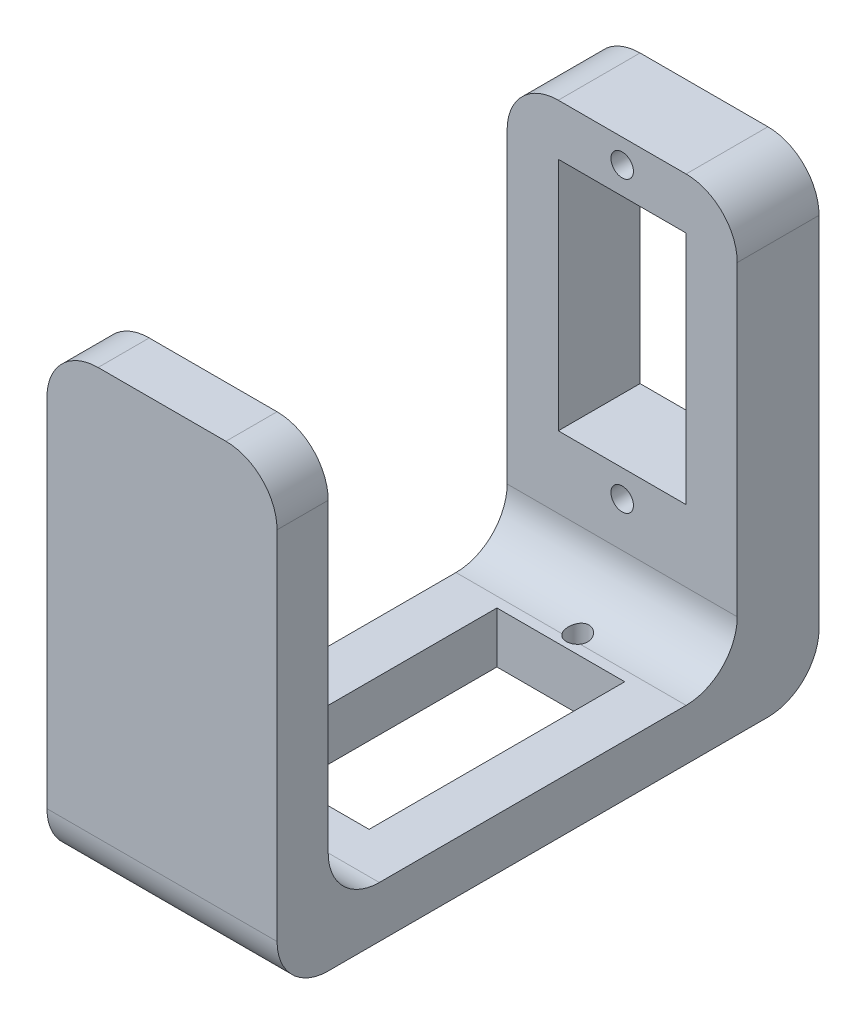
ISO-10303-21;
HEADER;
FILE_DESCRIPTION(('STEP AP214'),'2;1');
FILE_NAME('part.step','',(''),(''),'','','');
FILE_SCHEMA(('AUTOMOTIVE_DESIGN { 1 0 10303 214 1 1 1 1 }'));
ENDSEC;
DATA;
#1=APPLICATION_CONTEXT('core data for automotive mechanical design processes');
#2=APPLICATION_PROTOCOL_DEFINITION('international standard','automotive_design',2000,#1);
#3=PRODUCT_CONTEXT('',#1,'mechanical');
#4=PRODUCT('Part','Part','',(#3));
#5=PRODUCT_RELATED_PRODUCT_CATEGORY('part','',(#4));
#6=PRODUCT_DEFINITION_FORMATION('','',#4);
#7=PRODUCT_DEFINITION_CONTEXT('part definition',#1,'design');
#8=PRODUCT_DEFINITION('design','',#6,#7);
#9=PRODUCT_DEFINITION_SHAPE('','',#8);
#10=(LENGTH_UNIT() NAMED_UNIT(*) SI_UNIT(.MILLI.,.METRE.));
#11=(NAMED_UNIT(*) PLANE_ANGLE_UNIT() SI_UNIT($,.RADIAN.));
#12=(NAMED_UNIT(*) SI_UNIT($,.STERADIAN.) SOLID_ANGLE_UNIT());
#13=UNCERTAINTY_MEASURE_WITH_UNIT(LENGTH_MEASURE(1.E-05),#10,'distance_accuracy_value','');
#14=(GEOMETRIC_REPRESENTATION_CONTEXT(3) GLOBAL_UNCERTAINTY_ASSIGNED_CONTEXT((#13)) GLOBAL_UNIT_ASSIGNED_CONTEXT((#10,
#11,#12)) REPRESENTATION_CONTEXT('',''));
#15=CARTESIAN_POINT('',(0.,0.,0.));
#16=DIRECTION('',(0.,0.,1.));
#17=DIRECTION('',(1.,0.,0.));
#18=AXIS2_PLACEMENT_3D('',#15,#16,#17);
#19=CARTESIAN_POINT('',(0.,0.,8.));
#20=DIRECTION('',(0.,0.,1.));
#21=DIRECTION('',(1.,0.,0.));
#22=AXIS2_PLACEMENT_3D('',#19,#20,#21);
#23=PLANE('',#22);
#24=DIRECTION('',(-1.,0.,0.));
#25=VECTOR('',#24,1.);
#26=CARTESIAN_POINT('',(-11.25,16.5,8.));
#27=LINE('',#26,#25);
#28=CARTESIAN_POINT('',(6.24999999999999,16.5,8.));
#29=VERTEX_POINT('',#28);
#30=CARTESIAN_POINT('',(-6.25,16.5,8.));
#31=VERTEX_POINT('',#30);
#32=EDGE_CURVE('E297',#29,#31,#27,.T.);
#33=ORIENTED_EDGE('',*,*,#32,.T.);
#34=CARTESIAN_POINT('',(-6.25,11.5,8.));
#35=DIRECTION('',(0.,0.,1.));
#36=DIRECTION('',(1.,0.,0.));
#37=AXIS2_PLACEMENT_3D('',#34,#35,#36);
#38=CIRCLE('',#37,5.);
#39=CARTESIAN_POINT('',(-11.25,11.5,8.));
#40=VERTEX_POINT('',#39);
#41=EDGE_CURVE('E11',#31,#40,#38,.T.);
#42=ORIENTED_EDGE('',*,*,#41,.T.);
#43=DIRECTION('',(0.,-1.,0.));
#44=VECTOR('',#43,1.);
#45=CARTESIAN_POINT('',(-11.25,16.5,8.));
#46=LINE('',#45,#44);
#47=CARTESIAN_POINT('',(-11.25,-18.5,8.));
#48=VERTEX_POINT('',#47);
#49=EDGE_CURVE('E292',#40,#48,#46,.T.);
#50=ORIENTED_EDGE('',*,*,#49,.T.);
#51=DIRECTION('',(-1.,0.,0.));
#52=VECTOR('',#51,1.);
#53=CARTESIAN_POINT('',(0.,-18.5,8.));
#54=LINE('',#53,#52);
#55=CARTESIAN_POINT('',(11.25,-18.5,8.));
#56=VERTEX_POINT('',#55);
#57=EDGE_CURVE('E326',#48,#56,#54,.F.);
#58=ORIENTED_EDGE('',*,*,#57,.T.);
#59=DIRECTION('',(0.,1.,0.));
#60=VECTOR('',#59,1.);
#61=CARTESIAN_POINT('',(11.25,16.5,8.));
#62=LINE('',#61,#60);
#63=CARTESIAN_POINT('',(11.25,11.5,8.));
#64=VERTEX_POINT('',#63);
#65=EDGE_CURVE('E294',#56,#64,#62,.T.);
#66=ORIENTED_EDGE('',*,*,#65,.T.);
#67=CARTESIAN_POINT('',(6.25,11.5,8.));
#68=DIRECTION('',(0.,0.,1.));
#69=DIRECTION('',(1.,0.,0.));
#70=AXIS2_PLACEMENT_3D('',#67,#68,#69);
#71=CIRCLE('',#70,5.);
#72=EDGE_CURVE('E40',#64,#29,#71,.T.);
#73=ORIENTED_EDGE('',*,*,#72,.T.);
#74=EDGE_LOOP('',(#33,#42,#50,#58,#66,#73));
#75=FACE_BOUND('',#74,.T.);
#76=CARTESIAN_POINT('',(0.,-14.1452041028867,8.));
#77=DIRECTION('',(0.,0.,1.));
#78=DIRECTION('',(1.,0.,0.));
#79=AXIS2_PLACEMENT_3D('',#76,#77,#78);
#80=CIRCLE('',#79,1.1);
#81=CARTESIAN_POINT('',(1.09999999999998,-14.1452041028867,8.));
#82=VERTEX_POINT('',#81);
#83=EDGE_CURVE('E253',#82,#82,#80,.T.);
#84=ORIENTED_EDGE('',*,*,#83,.F.);
#85=EDGE_LOOP('',(#84));
#86=FACE_BOUND('',#85,.T.);
#87=CARTESIAN_POINT('',(0.,14.1452041028867,8.));
#88=DIRECTION('',(0.,0.,1.));
#89=DIRECTION('',(1.,0.,0.));
#90=AXIS2_PLACEMENT_3D('',#87,#88,#89);
#91=CIRCLE('',#90,1.09999999999999);
#92=CARTESIAN_POINT('',(1.09999999999997,14.1452041028867,8.));
#93=VERTEX_POINT('',#92);
#94=EDGE_CURVE('E248',#93,#93,#91,.T.);
#95=ORIENTED_EDGE('',*,*,#94,.F.);
#96=EDGE_LOOP('',(#95));
#97=FACE_BOUND('',#96,.T.);
#98=DIRECTION('',(-1.,0.,0.));
#99=VECTOR('',#98,1.);
#100=CARTESIAN_POINT('',(-6.25,11.5,8.));
#101=LINE('',#100,#99);
#102=CARTESIAN_POINT('',(6.25,11.5,8.));
#103=VERTEX_POINT('',#102);
#104=CARTESIAN_POINT('',(-6.25,11.5,8.));
#105=VERTEX_POINT('',#104);
#106=EDGE_CURVE('E263',#103,#105,#101,.T.);
#107=ORIENTED_EDGE('',*,*,#106,.F.);
#108=DIRECTION('',(0.,1.,0.));
#109=VECTOR('',#108,1.);
#110=CARTESIAN_POINT('',(6.25,11.5,8.));
#111=LINE('',#110,#109);
#112=CARTESIAN_POINT('',(6.25,-11.5,8.));
#113=VERTEX_POINT('',#112);
#114=EDGE_CURVE('E261',#113,#103,#111,.T.);
#115=ORIENTED_EDGE('',*,*,#114,.F.);
#116=DIRECTION('',(1.,0.,0.));
#117=VECTOR('',#116,1.);
#118=CARTESIAN_POINT('',(-6.25,-11.5,8.));
#119=LINE('',#118,#117);
#120=CARTESIAN_POINT('',(-6.25,-11.5,8.));
#121=VERTEX_POINT('',#120);
#122=EDGE_CURVE('E269',#121,#113,#119,.T.);
#123=ORIENTED_EDGE('',*,*,#122,.F.);
#124=DIRECTION('',(0.,-1.,0.));
#125=VECTOR('',#124,1.);
#126=CARTESIAN_POINT('',(-6.25,11.5,8.));
#127=LINE('',#126,#125);
#128=EDGE_CURVE('E266',#105,#121,#127,.T.);
#129=ORIENTED_EDGE('',*,*,#128,.F.);
#130=EDGE_LOOP('',(#107,#115,#123,#129));
#131=FACE_BOUND('',#130,.T.);
#132=ADVANCED_FACE('F32',(#75,#86,#97,#131),#23,.T.);
#133=CARTESIAN_POINT('',(0.,0.,0.));
#134=DIRECTION('',(0.,0.,1.));
#135=DIRECTION('',(1.,0.,0.));
#136=AXIS2_PLACEMENT_3D('',#133,#134,#135);
#137=PLANE('',#136);
#138=CARTESIAN_POINT('',(0.,-14.1452041028867,0.));
#139=DIRECTION('',(0.,0.,1.));
#140=DIRECTION('',(1.,0.,0.));
#141=AXIS2_PLACEMENT_3D('',#138,#139,#140);
#142=CIRCLE('',#141,1.1);
#143=CARTESIAN_POINT('',(1.09999999999998,-14.1452041028867,0.));
#144=VERTEX_POINT('',#143);
#145=EDGE_CURVE('E249',#144,#144,#142,.T.);
#146=ORIENTED_EDGE('',*,*,#145,.T.);
#147=EDGE_LOOP('',(#146));
#148=FACE_BOUND('',#147,.T.);
#149=CARTESIAN_POINT('',(0.,14.1452041028867,0.));
#150=DIRECTION('',(0.,0.,1.));
#151=DIRECTION('',(1.,0.,0.));
#152=AXIS2_PLACEMENT_3D('',#149,#150,#151);
#153=CIRCLE('',#152,1.09999999999999);
#154=CARTESIAN_POINT('',(1.09999999999997,14.1452041028867,0.));
#155=VERTEX_POINT('',#154);
#156=EDGE_CURVE('E256',#155,#155,#153,.T.);
#157=ORIENTED_EDGE('',*,*,#156,.T.);
#158=EDGE_LOOP('',(#157));
#159=FACE_BOUND('',#158,.T.);
#160=DIRECTION('',(0.,-1.,0.));
#161=VECTOR('',#160,1.);
#162=CARTESIAN_POINT('',(-11.25,16.5,0.));
#163=LINE('',#162,#161);
#164=CARTESIAN_POINT('',(-11.25,11.5,0.));
#165=VERTEX_POINT('',#164);
#166=CARTESIAN_POINT('',(-11.25,-23.5,0.));
#167=VERTEX_POINT('',#166);
#168=EDGE_CURVE('E291',#165,#167,#163,.T.);
#169=ORIENTED_EDGE('',*,*,#168,.F.);
#170=CARTESIAN_POINT('',(-6.25,11.5,0.));
#171=DIRECTION('',(0.,0.,1.));
#172=DIRECTION('',(1.,0.,0.));
#173=AXIS2_PLACEMENT_3D('',#170,#171,#172);
#174=CIRCLE('',#173,5.);
#175=CARTESIAN_POINT('',(-6.25,16.5,0.));
#176=VERTEX_POINT('',#175);
#177=EDGE_CURVE('E445',#165,#176,#174,.F.);
#178=ORIENTED_EDGE('',*,*,#177,.T.);
#179=DIRECTION('',(-1.,0.,0.));
#180=VECTOR('',#179,1.);
#181=CARTESIAN_POINT('',(-11.25,16.5,0.));
#182=LINE('',#181,#180);
#183=CARTESIAN_POINT('',(6.24999999999999,16.5,0.));
#184=VERTEX_POINT('',#183);
#185=EDGE_CURVE('E295',#184,#176,#182,.T.);
#186=ORIENTED_EDGE('',*,*,#185,.F.);
#187=CARTESIAN_POINT('',(6.25,11.5,0.));
#188=DIRECTION('',(0.,0.,1.));
#189=DIRECTION('',(1.,0.,0.));
#190=AXIS2_PLACEMENT_3D('',#187,#188,#189);
#191=CIRCLE('',#190,5.);
#192=CARTESIAN_POINT('',(11.25,11.5,0.));
#193=VERTEX_POINT('',#192);
#194=EDGE_CURVE('E443',#184,#193,#191,.F.);
#195=ORIENTED_EDGE('',*,*,#194,.T.);
#196=DIRECTION('',(0.,1.,0.));
#197=VECTOR('',#196,1.);
#198=CARTESIAN_POINT('',(11.25,16.5,0.));
#199=LINE('',#198,#197);
#200=CARTESIAN_POINT('',(11.25,-23.5,0.));
#201=VERTEX_POINT('',#200);
#202=EDGE_CURVE('E301',#201,#193,#199,.T.);
#203=ORIENTED_EDGE('',*,*,#202,.F.);
#204=DIRECTION('',(-1.,0.,0.));
#205=VECTOR('',#204,1.);
#206=CARTESIAN_POINT('',(-11.25,-23.5,0.));
#207=LINE('',#206,#205);
#208=EDGE_CURVE('E479',#201,#167,#207,.T.);
#209=ORIENTED_EDGE('',*,*,#208,.T.);
#210=EDGE_LOOP('',(#169,#178,#186,#195,#203,#209));
#211=FACE_BOUND('',#210,.T.);
#212=DIRECTION('',(0.,1.,0.));
#213=VECTOR('',#212,1.);
#214=CARTESIAN_POINT('',(6.25,11.5,0.));
#215=LINE('',#214,#213);
#216=CARTESIAN_POINT('',(6.25,-11.5,0.));
#217=VERTEX_POINT('',#216);
#218=CARTESIAN_POINT('',(6.25,11.5,0.));
#219=VERTEX_POINT('',#218);
#220=EDGE_CURVE('E252',#217,#219,#215,.T.);
#221=ORIENTED_EDGE('',*,*,#220,.T.);
#222=DIRECTION('',(-1.,0.,0.));
#223=VECTOR('',#222,1.);
#224=CARTESIAN_POINT('',(-6.25,11.5,0.));
#225=LINE('',#224,#223);
#226=CARTESIAN_POINT('',(-6.25,11.5,0.));
#227=VERTEX_POINT('',#226);
#228=EDGE_CURVE('E274',#219,#227,#225,.T.);
#229=ORIENTED_EDGE('',*,*,#228,.T.);
#230=DIRECTION('',(0.,-1.,0.));
#231=VECTOR('',#230,1.);
#232=CARTESIAN_POINT('',(-6.25,11.5,0.));
#233=LINE('',#232,#231);
#234=CARTESIAN_POINT('',(-6.25,-11.5,0.));
#235=VERTEX_POINT('',#234);
#236=EDGE_CURVE('E277',#227,#235,#233,.T.);
#237=ORIENTED_EDGE('',*,*,#236,.T.);
#238=DIRECTION('',(1.,0.,0.));
#239=VECTOR('',#238,1.);
#240=CARTESIAN_POINT('',(-6.25,-11.5,0.));
#241=LINE('',#240,#239);
#242=EDGE_CURVE('E264',#235,#217,#241,.T.);
#243=ORIENTED_EDGE('',*,*,#242,.T.);
#244=EDGE_LOOP('',(#221,#229,#237,#243));
#245=FACE_BOUND('',#244,.T.);
#246=ADVANCED_FACE('F381',(#148,#159,#211,#245),#137,.F.);
#247=CARTESIAN_POINT('',(-11.25,16.5,8.));
#248=DIRECTION('',(1.,0.,0.));
#249=DIRECTION('',(0.,1.,0.));
#250=AXIS2_PLACEMENT_3D('',#247,#248,#249);
#251=PLANE('',#250);
#252=DIRECTION('',(0.,-1.,0.));
#253=VECTOR('',#252,1.);
#254=CARTESIAN_POINT('',(-11.25,-28.5,53.));
#255=LINE('',#254,#253);
#256=CARTESIAN_POINT('',(-11.25,11.3655560728552,53.));
#257=VERTEX_POINT('',#256);
#258=CARTESIAN_POINT('',(-11.25,-23.5,53.));
#259=VERTEX_POINT('',#258);
#260=EDGE_CURVE('E231',#257,#259,#255,.T.);
#261=ORIENTED_EDGE('',*,*,#260,.F.);
#262=DIRECTION('',(0.,0.,1.));
#263=VECTOR('',#262,1.);
#264=CARTESIAN_POINT('',(-11.25,11.3655560728552,48.));
#265=LINE('',#264,#263);
#266=CARTESIAN_POINT('',(-11.25,11.3655560728552,48.));
#267=VERTEX_POINT('',#266);
#268=EDGE_CURVE('E441',#257,#267,#265,.F.);
#269=ORIENTED_EDGE('',*,*,#268,.T.);
#270=DIRECTION('',(0.,-1.,0.));
#271=VECTOR('',#270,1.);
#272=CARTESIAN_POINT('',(-11.25,-28.5,48.));
#273=LINE('',#272,#271);
#274=CARTESIAN_POINT('',(-11.25,-18.5,48.));
#275=VERTEX_POINT('',#274);
#276=EDGE_CURVE('E415',#267,#275,#273,.T.);
#277=ORIENTED_EDGE('',*,*,#276,.T.);
#278=CARTESIAN_POINT('',(-11.25,-18.5,43.));
#279=DIRECTION('',(1.,0.,0.));
#280=DIRECTION('',(0.,1.,0.));
#281=AXIS2_PLACEMENT_3D('',#278,#279,#280);
#282=CIRCLE('',#281,5.);
#283=CARTESIAN_POINT('',(-11.25,-23.5,43.));
#284=VERTEX_POINT('',#283);
#285=EDGE_CURVE('E477',#275,#284,#282,.T.);
#286=ORIENTED_EDGE('',*,*,#285,.T.);
#287=DIRECTION('',(0.,0.,-1.));
#288=VECTOR('',#287,1.);
#289=CARTESIAN_POINT('',(-11.25,-23.5,53.));
#290=LINE('',#289,#288);
#291=CARTESIAN_POINT('',(-11.25,-23.5,13.));
#292=VERTEX_POINT('',#291);
#293=EDGE_CURVE('E238',#284,#292,#290,.T.);
#294=ORIENTED_EDGE('',*,*,#293,.T.);
#295=CARTESIAN_POINT('',(-11.25,-18.5,13.));
#296=DIRECTION('',(1.,0.,0.));
#297=DIRECTION('',(0.,1.,0.));
#298=AXIS2_PLACEMENT_3D('',#295,#296,#297);
#299=CIRCLE('',#298,5.);
#300=EDGE_CURVE('E336',#292,#48,#299,.T.);
#301=ORIENTED_EDGE('',*,*,#300,.T.);
#302=ORIENTED_EDGE('',*,*,#49,.F.);
#303=DIRECTION('',(0.,0.,-1.));
#304=VECTOR('',#303,1.);
#305=CARTESIAN_POINT('',(-11.25,11.5,8.));
#306=LINE('',#305,#304);
#307=EDGE_CURVE('E438',#40,#165,#306,.T.);
#308=ORIENTED_EDGE('',*,*,#307,.T.);
#309=ORIENTED_EDGE('',*,*,#168,.T.);
#310=CARTESIAN_POINT('',(-11.25,-23.5,5.));
#311=DIRECTION('',(1.,0.,0.));
#312=DIRECTION('',(0.,1.,0.));
#313=AXIS2_PLACEMENT_3D('',#310,#311,#312);
#314=CIRCLE('',#313,5.);
#315=CARTESIAN_POINT('',(-11.25,-28.5,5.));
#316=VERTEX_POINT('',#315);
#317=EDGE_CURVE('E484',#167,#316,#314,.F.);
#318=ORIENTED_EDGE('',*,*,#317,.T.);
#319=DIRECTION('',(0.,0.,-1.));
#320=VECTOR('',#319,1.);
#321=CARTESIAN_POINT('',(-11.25,-28.5,33.5));
#322=LINE('',#321,#320);
#323=CARTESIAN_POINT('',(-11.25,-28.5,48.));
#324=VERTEX_POINT('',#323);
#325=EDGE_CURVE('E242',#324,#316,#322,.T.);
#326=ORIENTED_EDGE('',*,*,#325,.F.);
#327=CARTESIAN_POINT('',(-11.25,-23.5,48.));
#328=DIRECTION('',(1.,0.,0.));
#329=DIRECTION('',(0.,1.,0.));
#330=AXIS2_PLACEMENT_3D('',#327,#328,#329);
#331=CIRCLE('',#330,5.);
#332=EDGE_CURVE('E481',#324,#259,#331,.F.);
#333=ORIENTED_EDGE('',*,*,#332,.T.);
#334=EDGE_LOOP('',(#261,#269,#277,#286,#294,#301,#302,#308,#309,#318,#326,#333));
#335=FACE_BOUND('',#334,.T.);
#336=ADVANCED_FACE('F350',(#335),#251,.F.);
#337=CARTESIAN_POINT('',(11.25,16.5,8.));
#338=DIRECTION('',(-1.,0.,0.));
#339=DIRECTION('',(0.,-1.,0.));
#340=AXIS2_PLACEMENT_3D('',#337,#338,#339);
#341=PLANE('',#340);
#342=DIRECTION('',(0.,1.,0.));
#343=VECTOR('',#342,1.);
#344=CARTESIAN_POINT('',(11.25,-28.5,48.));
#345=LINE('',#344,#343);
#346=CARTESIAN_POINT('',(11.25,-18.5,48.));
#347=VERTEX_POINT('',#346);
#348=CARTESIAN_POINT('',(11.25,11.3655560728552,48.));
#349=VERTEX_POINT('',#348);
#350=EDGE_CURVE('E405',#347,#349,#345,.T.);
#351=ORIENTED_EDGE('',*,*,#350,.T.);
#352=DIRECTION('',(0.,0.,1.));
#353=VECTOR('',#352,1.);
#354=CARTESIAN_POINT('',(11.25,11.3655560728552,53.));
#355=LINE('',#354,#353);
#356=CARTESIAN_POINT('',(11.25,11.3655560728552,53.));
#357=VERTEX_POINT('',#356);
#358=EDGE_CURVE('E408',#349,#357,#355,.T.);
#359=ORIENTED_EDGE('',*,*,#358,.T.);
#360=DIRECTION('',(0.,1.,0.));
#361=VECTOR('',#360,1.);
#362=CARTESIAN_POINT('',(11.25,-28.5,53.));
#363=LINE('',#362,#361);
#364=CARTESIAN_POINT('',(11.25,-23.5,53.));
#365=VERTEX_POINT('',#364);
#366=EDGE_CURVE('E235',#365,#357,#363,.T.);
#367=ORIENTED_EDGE('',*,*,#366,.F.);
#368=CARTESIAN_POINT('',(11.25,-23.5,48.));
#369=DIRECTION('',(-1.,0.,0.));
#370=DIRECTION('',(0.,-1.,0.));
#371=AXIS2_PLACEMENT_3D('',#368,#369,#370);
#372=CIRCLE('',#371,5.);
#373=CARTESIAN_POINT('',(11.25,-28.5,48.));
#374=VERTEX_POINT('',#373);
#375=EDGE_CURVE('E490',#365,#374,#372,.F.);
#376=ORIENTED_EDGE('',*,*,#375,.T.);
#377=DIRECTION('',(0.,0.,-1.));
#378=VECTOR('',#377,1.);
#379=CARTESIAN_POINT('',(11.25,-28.5,33.5));
#380=LINE('',#379,#378);
#381=CARTESIAN_POINT('',(11.25,-28.5,5.));
#382=VERTEX_POINT('',#381);
#383=EDGE_CURVE('E245',#374,#382,#380,.T.);
#384=ORIENTED_EDGE('',*,*,#383,.T.);
#385=CARTESIAN_POINT('',(11.25,-23.5,5.));
#386=DIRECTION('',(-1.,0.,0.));
#387=DIRECTION('',(0.,-1.,0.));
#388=AXIS2_PLACEMENT_3D('',#385,#386,#387);
#389=CIRCLE('',#388,5.);
#390=EDGE_CURVE('E492',#382,#201,#389,.F.);
#391=ORIENTED_EDGE('',*,*,#390,.T.);
#392=ORIENTED_EDGE('',*,*,#202,.T.);
#393=DIRECTION('',(0.,0.,-1.));
#394=VECTOR('',#393,1.);
#395=CARTESIAN_POINT('',(11.25,11.5,8.));
#396=LINE('',#395,#394);
#397=EDGE_CURVE('E422',#193,#64,#396,.F.);
#398=ORIENTED_EDGE('',*,*,#397,.T.);
#399=ORIENTED_EDGE('',*,*,#65,.F.);
#400=CARTESIAN_POINT('',(11.25,-18.5,13.));
#401=DIRECTION('',(-1.,0.,0.));
#402=DIRECTION('',(0.,-1.,0.));
#403=AXIS2_PLACEMENT_3D('',#400,#401,#402);
#404=CIRCLE('',#403,5.);
#405=CARTESIAN_POINT('',(11.25,-23.5,13.));
#406=VERTEX_POINT('',#405);
#407=EDGE_CURVE('E467',#56,#406,#404,.T.);
#408=ORIENTED_EDGE('',*,*,#407,.T.);
#409=DIRECTION('',(0.,0.,-1.));
#410=VECTOR('',#409,1.);
#411=CARTESIAN_POINT('',(11.25,-23.5,53.));
#412=LINE('',#411,#410);
#413=CARTESIAN_POINT('',(11.25,-23.5,43.));
#414=VERTEX_POINT('',#413);
#415=EDGE_CURVE('E240',#414,#406,#412,.T.);
#416=ORIENTED_EDGE('',*,*,#415,.F.);
#417=CARTESIAN_POINT('',(11.25,-18.5,43.));
#418=DIRECTION('',(-1.,0.,0.));
#419=DIRECTION('',(0.,-1.,0.));
#420=AXIS2_PLACEMENT_3D('',#417,#418,#419);
#421=CIRCLE('',#420,5.);
#422=EDGE_CURVE('E410',#414,#347,#421,.T.);
#423=ORIENTED_EDGE('',*,*,#422,.T.);
#424=EDGE_LOOP('',(#351,#359,#367,#376,#384,#391,#392,#398,#399,#408,#416,#423));
#425=FACE_BOUND('',#424,.T.);
#426=ADVANCED_FACE('F395',(#425),#341,.F.);
#427=CARTESIAN_POINT('',(-11.25,16.5,8.));
#428=DIRECTION('',(0.,-1.,0.));
#429=DIRECTION('',(0.,0.,-1.));
#430=AXIS2_PLACEMENT_3D('',#427,#428,#429);
#431=PLANE('',#430);
#432=ORIENTED_EDGE('',*,*,#185,.T.);
#433=DIRECTION('',(0.,0.,-1.));
#434=VECTOR('',#433,1.);
#435=CARTESIAN_POINT('',(-6.25,16.5,8.));
#436=LINE('',#435,#434);
#437=EDGE_CURVE('E47',#176,#31,#436,.F.);
#438=ORIENTED_EDGE('',*,*,#437,.T.);
#439=ORIENTED_EDGE('',*,*,#32,.F.);
#440=DIRECTION('',(0.,0.,-1.));
#441=VECTOR('',#440,1.);
#442=CARTESIAN_POINT('',(6.25,16.5,8.));
#443=LINE('',#442,#441);
#444=EDGE_CURVE('E447',#29,#184,#443,.T.);
#445=ORIENTED_EDGE('',*,*,#444,.T.);
#446=EDGE_LOOP('',(#432,#438,#439,#445));
#447=FACE_BOUND('',#446,.T.);
#448=ADVANCED_FACE('F393',(#447),#431,.F.);
#449=CARTESIAN_POINT('',(6.25,11.5,8.));
#450=DIRECTION('',(-1.,0.,0.));
#451=DIRECTION('',(0.,-1.,0.));
#452=AXIS2_PLACEMENT_3D('',#449,#450,#451);
#453=PLANE('',#452);
#454=ORIENTED_EDGE('',*,*,#220,.F.);
#455=DIRECTION('',(0.,0.,-1.));
#456=VECTOR('',#455,1.);
#457=CARTESIAN_POINT('',(6.25,-11.5,8.));
#458=LINE('',#457,#456);
#459=EDGE_CURVE('E271',#113,#217,#458,.T.);
#460=ORIENTED_EDGE('',*,*,#459,.F.);
#461=ORIENTED_EDGE('',*,*,#114,.T.);
#462=DIRECTION('',(0.,0.,-1.));
#463=VECTOR('',#462,1.);
#464=CARTESIAN_POINT('',(6.25,11.5,8.));
#465=LINE('',#464,#463);
#466=EDGE_CURVE('E288',#103,#219,#465,.T.);
#467=ORIENTED_EDGE('',*,*,#466,.T.);
#468=EDGE_LOOP('',(#454,#460,#461,#467));
#469=FACE_BOUND('',#468,.T.);
#470=ADVANCED_FACE('F390',(#469),#453,.T.);
#471=CARTESIAN_POINT('',(-6.25,11.5,8.));
#472=DIRECTION('',(0.,-1.,0.));
#473=DIRECTION('',(0.,0.,-1.));
#474=AXIS2_PLACEMENT_3D('',#471,#472,#473);
#475=PLANE('',#474);
#476=ORIENTED_EDGE('',*,*,#228,.F.);
#477=ORIENTED_EDGE('',*,*,#466,.F.);
#478=ORIENTED_EDGE('',*,*,#106,.T.);
#479=DIRECTION('',(0.,0.,-1.));
#480=VECTOR('',#479,1.);
#481=CARTESIAN_POINT('',(-6.25,11.5,8.));
#482=LINE('',#481,#480);
#483=EDGE_CURVE('E286',#105,#227,#482,.T.);
#484=ORIENTED_EDGE('',*,*,#483,.T.);
#485=EDGE_LOOP('',(#476,#477,#478,#484));
#486=FACE_BOUND('',#485,.T.);
#487=ADVANCED_FACE('F559',(#486),#475,.T.);
#488=CARTESIAN_POINT('',(-6.25,11.5,8.));
#489=DIRECTION('',(1.,0.,0.));
#490=DIRECTION('',(0.,1.,0.));
#491=AXIS2_PLACEMENT_3D('',#488,#489,#490);
#492=PLANE('',#491);
#493=ORIENTED_EDGE('',*,*,#236,.F.);
#494=ORIENTED_EDGE('',*,*,#483,.F.);
#495=ORIENTED_EDGE('',*,*,#128,.T.);
#496=DIRECTION('',(0.,0.,-1.));
#497=VECTOR('',#496,1.);
#498=CARTESIAN_POINT('',(-6.25,-11.5,8.));
#499=LINE('',#498,#497);
#500=EDGE_CURVE('E284',#121,#235,#499,.T.);
#501=ORIENTED_EDGE('',*,*,#500,.T.);
#502=EDGE_LOOP('',(#493,#494,#495,#501));
#503=FACE_BOUND('',#502,.T.);
#504=ADVANCED_FACE('F556',(#503),#492,.T.);
#505=CARTESIAN_POINT('',(-6.25,-11.5,8.));
#506=DIRECTION('',(0.,1.,0.));
#507=DIRECTION('',(0.,0.,1.));
#508=AXIS2_PLACEMENT_3D('',#505,#506,#507);
#509=PLANE('',#508);
#510=ORIENTED_EDGE('',*,*,#242,.F.);
#511=ORIENTED_EDGE('',*,*,#500,.F.);
#512=ORIENTED_EDGE('',*,*,#122,.T.);
#513=ORIENTED_EDGE('',*,*,#459,.T.);
#514=EDGE_LOOP('',(#510,#511,#512,#513));
#515=FACE_BOUND('',#514,.T.);
#516=ADVANCED_FACE('F552',(#515),#509,.T.);
#517=CARTESIAN_POINT('',(0.,14.1452041028867,0.));
#518=DIRECTION('',(0.,0.,1.));
#519=DIRECTION('',(1.,0.,0.));
#520=AXIS2_PLACEMENT_3D('',#517,#518,#519);
#521=CYLINDRICAL_SURFACE('',#520,1.09999999999999);
#522=ORIENTED_EDGE('',*,*,#156,.F.);
#523=EDGE_LOOP('',(#522));
#524=FACE_BOUND('',#523,.T.);
#525=ORIENTED_EDGE('',*,*,#94,.T.);
#526=EDGE_LOOP('',(#525));
#527=FACE_BOUND('',#526,.T.);
#528=ADVANCED_FACE('F548',(#524,#527),#521,.F.);
#529=CARTESIAN_POINT('',(0.,-14.1452041028867,0.));
#530=DIRECTION('',(0.,0.,1.));
#531=DIRECTION('',(1.,0.,0.));
#532=AXIS2_PLACEMENT_3D('',#529,#530,#531);
#533=CYLINDRICAL_SURFACE('',#532,1.1);
#534=ORIENTED_EDGE('',*,*,#145,.F.);
#535=EDGE_LOOP('',(#534));
#536=FACE_BOUND('',#535,.T.);
#537=ORIENTED_EDGE('',*,*,#83,.T.);
#538=EDGE_LOOP('',(#537));
#539=FACE_BOUND('',#538,.T.);
#540=ADVANCED_FACE('F541',(#536,#539),#533,.F.);
#541=CARTESIAN_POINT('',(11.25,-28.5,33.5));
#542=DIRECTION('',(0.,-1.,0.));
#543=DIRECTION('',(0.,0.,-1.));
#544=AXIS2_PLACEMENT_3D('',#541,#542,#543);
#545=PLANE('',#544);
#546=ORIENTED_EDGE('',*,*,#325,.T.);
#547=DIRECTION('',(-1.,0.,0.));
#548=VECTOR('',#547,1.);
#549=CARTESIAN_POINT('',(11.25,-28.5,5.));
#550=LINE('',#549,#548);
#551=EDGE_CURVE('E488',#316,#382,#550,.F.);
#552=ORIENTED_EDGE('',*,*,#551,.T.);
#553=ORIENTED_EDGE('',*,*,#383,.F.);
#554=DIRECTION('',(1.,0.,0.));
#555=VECTOR('',#554,1.);
#556=CARTESIAN_POINT('',(-11.25,-28.5,48.));
#557=LINE('',#556,#555);
#558=EDGE_CURVE('E486',#374,#324,#557,.F.);
#559=ORIENTED_EDGE('',*,*,#558,.T.);
#560=EDGE_LOOP('',(#546,#552,#553,#559));
#561=FACE_BOUND('',#560,.T.);
#562=CARTESIAN_POINT('',(0.,-28.5,40.6452041028867));
#563=DIRECTION('',(0.,-1.,0.));
#564=DIRECTION('',(0.,0.,-1.));
#565=AXIS2_PLACEMENT_3D('',#562,#563,#564);
#566=CIRCLE('',#565,1.09999999999999);
#567=CARTESIAN_POINT('',(0.,-28.5,39.5452041028867));
#568=VERTEX_POINT('',#567);
#569=EDGE_CURVE('E318',#568,#568,#566,.T.);
#570=ORIENTED_EDGE('',*,*,#569,.F.);
#571=EDGE_LOOP('',(#570));
#572=FACE_BOUND('',#571,.T.);
#573=CARTESIAN_POINT('',(0.,-28.5,12.3547958971133));
#574=DIRECTION('',(0.,-1.,0.));
#575=DIRECTION('',(0.,0.,-1.));
#576=AXIS2_PLACEMENT_3D('',#573,#574,#575);
#577=CIRCLE('',#576,1.1);
#578=CARTESIAN_POINT('',(0.,-28.5,11.2547958971133));
#579=VERTEX_POINT('',#578);
#580=EDGE_CURVE('E516',#579,#579,#577,.T.);
#581=ORIENTED_EDGE('',*,*,#580,.F.);
#582=EDGE_LOOP('',(#581));
#583=FACE_BOUND('',#582,.T.);
#584=DIRECTION('',(0.,0.,1.));
#585=VECTOR('',#584,1.);
#586=CARTESIAN_POINT('',(6.25,-28.5,14.));
#587=LINE('',#586,#585);
#588=CARTESIAN_POINT('',(6.25,-28.5,14.));
#589=VERTEX_POINT('',#588);
#590=CARTESIAN_POINT('',(6.25,-28.5,39.));
#591=VERTEX_POINT('',#590);
#592=EDGE_CURVE('E220',#589,#591,#587,.T.);
#593=ORIENTED_EDGE('',*,*,#592,.F.);
#594=DIRECTION('',(1.,0.,0.));
#595=VECTOR('',#594,1.);
#596=CARTESIAN_POINT('',(-6.25,-28.5,14.));
#597=LINE('',#596,#595);
#598=CARTESIAN_POINT('',(-6.25,-28.5,14.));
#599=VERTEX_POINT('',#598);
#600=EDGE_CURVE('E224',#599,#589,#597,.T.);
#601=ORIENTED_EDGE('',*,*,#600,.F.);
#602=DIRECTION('',(0.,0.,-1.));
#603=VECTOR('',#602,1.);
#604=CARTESIAN_POINT('',(-6.25,-28.5,14.));
#605=LINE('',#604,#603);
#606=CARTESIAN_POINT('',(-6.25,-28.5,39.));
#607=VERTEX_POINT('',#606);
#608=EDGE_CURVE('E204',#607,#599,#605,.T.);
#609=ORIENTED_EDGE('',*,*,#608,.F.);
#610=DIRECTION('',(-1.,0.,0.));
#611=VECTOR('',#610,1.);
#612=CARTESIAN_POINT('',(-6.25,-28.5,39.));
#613=LINE('',#612,#611);
#614=EDGE_CURVE('E215',#591,#607,#613,.T.);
#615=ORIENTED_EDGE('',*,*,#614,.F.);
#616=EDGE_LOOP('',(#593,#601,#609,#615));
#617=FACE_BOUND('',#616,.T.);
#618=ADVANCED_FACE('F222',(#561,#572,#583,#617),#545,.T.);
#619=CARTESIAN_POINT('',(-11.25,-23.5,53.));
#620=DIRECTION('',(0.,-1.,0.));
#621=DIRECTION('',(0.,0.,-1.));
#622=AXIS2_PLACEMENT_3D('',#619,#620,#621);
#623=PLANE('',#622);
#624=CARTESIAN_POINT('',(0.,-23.5,40.6452041028867));
#625=DIRECTION('',(0.,-1.,0.));
#626=DIRECTION('',(0.,0.,-1.));
#627=AXIS2_PLACEMENT_3D('',#624,#625,#626);
#628=CIRCLE('',#627,1.09999999999999);
#629=CARTESIAN_POINT('',(0.,-23.5,39.5452041028867));
#630=VERTEX_POINT('',#629);
#631=EDGE_CURVE('E317',#630,#630,#628,.T.);
#632=ORIENTED_EDGE('',*,*,#631,.T.);
#633=EDGE_LOOP('',(#632));
#634=FACE_BOUND('',#633,.T.);
#635=ORIENTED_EDGE('',*,*,#293,.F.);
#636=DIRECTION('',(1.,0.,0.));
#637=VECTOR('',#636,1.);
#638=CARTESIAN_POINT('',(-11.25,-23.5,43.));
#639=LINE('',#638,#637);
#640=EDGE_CURVE('E470',#284,#414,#639,.T.);
#641=ORIENTED_EDGE('',*,*,#640,.T.);
#642=ORIENTED_EDGE('',*,*,#415,.T.);
#643=DIRECTION('',(-1.,0.,0.));
#644=VECTOR('',#643,1.);
#645=CARTESIAN_POINT('',(-11.25,-23.5,13.));
#646=LINE('',#645,#644);
#647=CARTESIAN_POINT('',(0.890904970026617,-23.5,13.));
#648=VERTEX_POINT('',#647);
#649=EDGE_CURVE('E323',#406,#648,#646,.T.);
#650=ORIENTED_EDGE('',*,*,#649,.T.);
#651=CARTESIAN_POINT('',(0.,-23.5,12.3547958971133));
#652=DIRECTION('',(0.,-1.,0.));
#653=DIRECTION('',(0.,0.,-1.));
#654=AXIS2_PLACEMENT_3D('',#651,#652,#653);
#655=CIRCLE('',#654,1.1);
#656=CARTESIAN_POINT('',(-0.890904970026615,-23.5,13.));
#657=VERTEX_POINT('',#656);
#658=EDGE_CURVE('E314',#648,#657,#655,.T.);
#659=ORIENTED_EDGE('',*,*,#658,.T.);
#660=DIRECTION('',(-1.,0.,0.));
#661=VECTOR('',#660,1.);
#662=CARTESIAN_POINT('',(-11.25,-23.5,13.));
#663=LINE('',#662,#661);
#664=EDGE_CURVE('E313',#657,#292,#663,.T.);
#665=ORIENTED_EDGE('',*,*,#664,.T.);
#666=EDGE_LOOP('',(#635,#641,#642,#650,#659,#665));
#667=FACE_BOUND('',#666,.T.);
#668=DIRECTION('',(1.,0.,0.));
#669=VECTOR('',#668,1.);
#670=CARTESIAN_POINT('',(-11.25,-23.5,14.));
#671=LINE('',#670,#669);
#672=CARTESIAN_POINT('',(-6.25,-23.5,14.));
#673=VERTEX_POINT('',#672);
#674=CARTESIAN_POINT('',(6.25,-23.5,14.));
#675=VERTEX_POINT('',#674);
#676=EDGE_CURVE('E307',#673,#675,#671,.T.);
#677=ORIENTED_EDGE('',*,*,#676,.T.);
#678=DIRECTION('',(0.,0.,1.));
#679=VECTOR('',#678,1.);
#680=CARTESIAN_POINT('',(6.25,-23.5,53.));
#681=LINE('',#680,#679);
#682=CARTESIAN_POINT('',(6.25,-23.5,39.));
#683=VERTEX_POINT('',#682);
#684=EDGE_CURVE('E310',#675,#683,#681,.T.);
#685=ORIENTED_EDGE('',*,*,#684,.T.);
#686=DIRECTION('',(-1.,0.,0.));
#687=VECTOR('',#686,1.);
#688=CARTESIAN_POINT('',(-11.25,-23.5,39.));
#689=LINE('',#688,#687);
#690=CARTESIAN_POINT('',(-6.25,-23.5,39.));
#691=VERTEX_POINT('',#690);
#692=EDGE_CURVE('E299',#683,#691,#689,.T.);
#693=ORIENTED_EDGE('',*,*,#692,.T.);
#694=DIRECTION('',(0.,0.,-1.));
#695=VECTOR('',#694,1.);
#696=CARTESIAN_POINT('',(-6.25,-23.5,53.));
#697=LINE('',#696,#695);
#698=EDGE_CURVE('E207',#691,#673,#697,.T.);
#699=ORIENTED_EDGE('',*,*,#698,.T.);
#700=EDGE_LOOP('',(#677,#685,#693,#699));
#701=FACE_BOUND('',#700,.T.);
#702=ADVANCED_FACE('F532',(#634,#667,#701),#623,.F.);
#703=CARTESIAN_POINT('',(0.,0.,53.));
#704=DIRECTION('',(0.,0.,-1.));
#705=DIRECTION('',(-1.,0.,0.));
#706=AXIS2_PLACEMENT_3D('',#703,#704,#705);
#707=PLANE('',#706);
#708=ORIENTED_EDGE('',*,*,#366,.T.);
#709=CARTESIAN_POINT('',(6.25,11.3655560728552,53.));
#710=DIRECTION('',(0.,0.,-1.));
#711=DIRECTION('',(-1.,0.,0.));
#712=AXIS2_PLACEMENT_3D('',#709,#710,#711);
#713=CIRCLE('',#712,5.);
#714=CARTESIAN_POINT('',(6.24999999999999,16.3655560728552,53.));
#715=VERTEX_POINT('',#714);
#716=EDGE_CURVE('E420',#357,#715,#713,.F.);
#717=ORIENTED_EDGE('',*,*,#716,.T.);
#718=DIRECTION('',(-1.,0.,0.));
#719=VECTOR('',#718,1.);
#720=CARTESIAN_POINT('',(-11.25,16.3655560728552,53.));
#721=LINE('',#720,#719);
#722=CARTESIAN_POINT('',(-6.25,16.3655560728552,53.));
#723=VERTEX_POINT('',#722);
#724=EDGE_CURVE('E522',#715,#723,#721,.T.);
#725=ORIENTED_EDGE('',*,*,#724,.T.);
#726=CARTESIAN_POINT('',(-6.25,11.3655560728552,53.));
#727=DIRECTION('',(0.,0.,-1.));
#728=DIRECTION('',(-1.,0.,0.));
#729=AXIS2_PLACEMENT_3D('',#726,#727,#728);
#730=CIRCLE('',#729,5.);
#731=EDGE_CURVE('E421',#723,#257,#730,.F.);
#732=ORIENTED_EDGE('',*,*,#731,.T.);
#733=ORIENTED_EDGE('',*,*,#260,.T.);
#734=DIRECTION('',(1.,0.,0.));
#735=VECTOR('',#734,1.);
#736=CARTESIAN_POINT('',(11.25,-23.5,53.));
#737=LINE('',#736,#735);
#738=EDGE_CURVE('E425',#259,#365,#737,.T.);
#739=ORIENTED_EDGE('',*,*,#738,.T.);
#740=EDGE_LOOP('',(#708,#717,#725,#732,#733,#739));
#741=FACE_BOUND('',#740,.T.);
#742=ADVANCED_FACE('F496',(#741),#707,.F.);
#743=CARTESIAN_POINT('',(6.25,16.5,14.));
#744=DIRECTION('',(1.,0.,0.));
#745=DIRECTION('',(0.,0.,-1.));
#746=AXIS2_PLACEMENT_3D('',#743,#744,#745);
#747=PLANE('',#746);
#748=DIRECTION('',(0.,-1.,0.));
#749=VECTOR('',#748,1.);
#750=CARTESIAN_POINT('',(6.25,16.5,14.));
#751=LINE('',#750,#749);
#752=EDGE_CURVE('E229',#675,#589,#751,.T.);
#753=ORIENTED_EDGE('',*,*,#752,.T.);
#754=ORIENTED_EDGE('',*,*,#592,.T.);
#755=DIRECTION('',(0.,-1.,0.));
#756=VECTOR('',#755,1.);
#757=CARTESIAN_POINT('',(6.25,16.5,39.));
#758=LINE('',#757,#756);
#759=EDGE_CURVE('E211',#683,#591,#758,.T.);
#760=ORIENTED_EDGE('',*,*,#759,.F.);
#761=ORIENTED_EDGE('',*,*,#684,.F.);
#762=EDGE_LOOP('',(#753,#754,#760,#761));
#763=FACE_BOUND('',#762,.T.);
#764=ADVANCED_FACE('F527',(#763),#747,.F.);
#765=CARTESIAN_POINT('',(-6.25,16.5,14.));
#766=DIRECTION('',(0.,0.,-1.));
#767=DIRECTION('',(-1.,0.,0.));
#768=AXIS2_PLACEMENT_3D('',#765,#766,#767);
#769=PLANE('',#768);
#770=DIRECTION('',(0.,-1.,0.));
#771=VECTOR('',#770,1.);
#772=CARTESIAN_POINT('',(-6.25,16.5,14.));
#773=LINE('',#772,#771);
#774=EDGE_CURVE('E210',#673,#599,#773,.T.);
#775=ORIENTED_EDGE('',*,*,#774,.T.);
#776=ORIENTED_EDGE('',*,*,#600,.T.);
#777=ORIENTED_EDGE('',*,*,#752,.F.);
#778=ORIENTED_EDGE('',*,*,#676,.F.);
#779=EDGE_LOOP('',(#775,#776,#777,#778));
#780=FACE_BOUND('',#779,.T.);
#781=ADVANCED_FACE('F530',(#780),#769,.F.);
#782=CARTESIAN_POINT('',(-6.25,16.5,14.));
#783=DIRECTION('',(-1.,0.,0.));
#784=DIRECTION('',(0.,0.,1.));
#785=AXIS2_PLACEMENT_3D('',#782,#783,#784);
#786=PLANE('',#785);
#787=DIRECTION('',(0.,-1.,0.));
#788=VECTOR('',#787,1.);
#789=CARTESIAN_POINT('',(-6.25,16.5,39.));
#790=LINE('',#789,#788);
#791=EDGE_CURVE('E199',#691,#607,#790,.T.);
#792=ORIENTED_EDGE('',*,*,#791,.T.);
#793=ORIENTED_EDGE('',*,*,#608,.T.);
#794=ORIENTED_EDGE('',*,*,#774,.F.);
#795=ORIENTED_EDGE('',*,*,#698,.F.);
#796=EDGE_LOOP('',(#792,#793,#794,#795));
#797=FACE_BOUND('',#796,.T.);
#798=ADVANCED_FACE('F201',(#797),#786,.F.);
#799=CARTESIAN_POINT('',(-6.25,16.5,39.));
#800=DIRECTION('',(0.,0.,1.));
#801=DIRECTION('',(1.,0.,0.));
#802=AXIS2_PLACEMENT_3D('',#799,#800,#801);
#803=PLANE('',#802);
#804=ORIENTED_EDGE('',*,*,#759,.T.);
#805=ORIENTED_EDGE('',*,*,#614,.T.);
#806=ORIENTED_EDGE('',*,*,#791,.F.);
#807=ORIENTED_EDGE('',*,*,#692,.F.);
#808=EDGE_LOOP('',(#804,#805,#806,#807));
#809=FACE_BOUND('',#808,.T.);
#810=ADVANCED_FACE('F216',(#809),#803,.F.);
#811=CARTESIAN_POINT('',(0.,36.5,12.3547958971133));
#812=DIRECTION('',(0.,-1.,0.));
#813=DIRECTION('',(0.,0.,-1.));
#814=AXIS2_PLACEMENT_3D('',#811,#812,#813);
#815=CYLINDRICAL_SURFACE('',#814,1.1);
#816=ORIENTED_EDGE('',*,*,#580,.T.);
#817=EDGE_LOOP('',(#816));
#818=FACE_BOUND('',#817,.T.);
#819=ORIENTED_EDGE('',*,*,#658,.F.);
#820=CARTESIAN_POINT('',(0.890904970026617,-23.5,13.));
#821=CARTESIAN_POINT('',(0.908757330992253,-23.5000004512762,12.9753492047726));
#822=CARTESIAN_POINT('',(0.925577794131906,-23.4998174190958,12.9499682580407));
#823=CARTESIAN_POINT('',(0.957056791173482,-23.4990254022565,12.8979060223035));
#824=CARTESIAN_POINT('',(0.97171533619872,-23.4984164197891,12.8712247399895));
#825=CARTESIAN_POINT('',(1.01225010521984,-23.4958652801126,12.7895727696548));
#826=CARTESIAN_POINT('',(1.03475355284946,-23.4931993740466,12.7328997242006));
#827=CARTESIAN_POINT('',(1.07008242597882,-23.485630003307,12.616743248611));
#828=CARTESIAN_POINT('',(1.0829010560088,-23.4807249713878,12.5572578762119));
#829=CARTESIAN_POINT('',(1.09857387903426,-23.4685941044527,12.4372323373516));
#830=CARTESIAN_POINT('',(1.10143046599286,-23.4613688274672,12.3766924278195));
#831=CARTESIAN_POINT('',(1.09723257190561,-23.4447429980618,12.2562126573741));
#832=CARTESIAN_POINT('',(1.09016913762,-23.4353404869947,12.1962733877567));
#833=CARTESIAN_POINT('',(1.0664595410742,-23.414738025896,12.0786314577412));
#834=CARTESIAN_POINT('',(1.04981011595528,-23.4035374647846,12.0209295660385));
#835=CARTESIAN_POINT('',(1.00690666767863,-23.3795797610754,11.9076892915292));
#836=CARTESIAN_POINT('',(0.98040345763377,-23.3667885378088,11.8522526047147));
#837=CARTESIAN_POINT('',(0.918633224867675,-23.3406657200352,11.746636853568));
#838=CARTESIAN_POINT('',(0.88336484246168,-23.3273340419596,11.6964586066622));
#839=CARTESIAN_POINT('',(0.803735053557062,-23.3005983127922,11.6011496867558));
#840=CARTESIAN_POINT('',(0.759128116584258,-23.2872045633765,11.5562208149945));
#841=CARTESIAN_POINT('',(0.662636063570588,-23.2617963543266,11.4745062985657));
#842=CARTESIAN_POINT('',(0.610750736949199,-23.2497819346179,11.4377208895867));
#843=CARTESIAN_POINT('',(0.501573841091959,-23.2282715585164,11.3737838535043));
#844=CARTESIAN_POINT('',(0.44434104821857,-23.2187517868847,11.3465402230543));
#845=CARTESIAN_POINT('',(0.325652808629565,-23.202981465789,11.3021999354433));
#846=CARTESIAN_POINT('',(0.264199321821733,-23.196729410397,11.2850986037104));
#847=CARTESIAN_POINT('',(0.142401691980551,-23.188374203967,11.2623906391568));
#848=CARTESIAN_POINT('',(0.0821785588557529,-23.1860641689458,11.2562101767476));
#849=CARTESIAN_POINT('',(-0.0384865913779952,-23.1851726437255,11.2538155209715));
#850=CARTESIAN_POINT('',(-0.0989285555098726,-23.1865903044329,11.2575990580076));
#851=CARTESIAN_POINT('',(-0.215963284204698,-23.1928905738303,11.2746439046418));
#852=CARTESIAN_POINT('',(-0.272615691073177,-23.1976428505152,11.2875488427023));
#853=CARTESIAN_POINT('',(-0.382899236244813,-23.2100480230001,11.3219714812305));
#854=CARTESIAN_POINT('',(-0.436530023016553,-23.2177012554966,11.3434901814619));
#855=CARTESIAN_POINT('',(-0.540759741151307,-23.2355049672468,11.3950849164531));
#856=CARTESIAN_POINT('',(-0.591249162638727,-23.2457131662607,11.4253616896412));
#857=CARTESIAN_POINT('',(-0.686548348424411,-23.2677348608246,11.493355033009));
#858=CARTESIAN_POINT('',(-0.731356510400777,-23.2795488073158,11.5310736944389));
#859=CARTESIAN_POINT('',(-0.816671862416574,-23.3046507252031,11.6153102404291));
#860=CARTESIAN_POINT('',(-0.856795208317697,-23.3179842325835,11.6622038046883));
#861=CARTESIAN_POINT('',(-0.928670081740348,-23.344597800993,11.7620422389681));
#862=CARTESIAN_POINT('',(-0.960419901080333,-23.3578778505736,11.8149883405406));
#863=CARTESIAN_POINT('',(-1.01544123257409,-23.3838900102527,11.9271451664238));
#864=CARTESIAN_POINT('',(-1.03845675416838,-23.3965971555978,11.9864877416873));
#865=CARTESIAN_POINT('',(-1.07396907454984,-23.420285213164,12.1085659177415));
#866=CARTESIAN_POINT('',(-1.08646819643024,-23.4312665061932,12.1713007659119));
#867=CARTESIAN_POINT('',(-1.10025869797781,-23.4507303215073,12.2969875830488));
#868=CARTESIAN_POINT('',(-1.10178369248765,-23.4592611921479,12.3599063132249));
#869=CARTESIAN_POINT('',(-1.0940267744015,-23.4738483485225,12.4853924907854));
#870=CARTESIAN_POINT('',(-1.08474220239797,-23.4799040248051,12.5479598479177));
#871=CARTESIAN_POINT('',(-1.05600582088718,-23.4893743264096,12.6687825111895));
#872=CARTESIAN_POINT('',(-1.03688834307983,-23.4928671539114,12.7271117187573));
#873=CARTESIAN_POINT('',(-0.989208073477918,-23.4977485529603,12.8397626186009));
#874=CARTESIAN_POINT('',(-0.960664557651837,-23.4991413868453,12.8940922149497));
#875=CARTESIAN_POINT('',(-0.916078620879363,-23.4999064596763,12.9641287114446));
#876=CARTESIAN_POINT('',(-0.903756017735537,-23.5000016599994,12.982263280377));
#877=CARTESIAN_POINT('',(-0.890904970026615,-23.5,13.));
#878=B_SPLINE_CURVE_WITH_KNOTS('',3,(#820,#821,#822,#823,#824,#825,#826,#827,#828,#829,#830,
#831,#832,#833,#834,#835,#836,#837,#838,#839,#840,#841,#842,#843,#844,#845,#846,#847,#848,#849,
#850,#851,#852,#853,#854,#855,#856,#857,#858,#859,#860,#861,#862,#863,#864,#865,#866,#867,#868,
#869,#870,#871,#872,#873,#874,#875,#876,#877),.UNSPECIFIED.,.F.,.F.,(4,2,2,2,2,2,2,2,2,2,2,2,2,
2,2,2,2,2,2,2,2,2,2,2,2,2,2,2,4),(0.,0.0912540955512421,0.182507721573448,0.364670626598735,
0.546961230035119,0.729208024479777,0.911619410129276,1.09409292130687,1.28153516060105,
1.46900649477187,1.6622227758424,1.85544464825696,2.04674854117205,2.23796419371983,
2.41879503985498,2.59958469995356,2.7736756141511,2.94778674021807,3.12625656212045,
3.30477660756656,3.49334105477467,3.68194393902559,3.87571174490152,4.06943673584424,
4.25902520951843,4.44866033627337,4.63223643132581,4.81543941967739,4.88117104195755),.UNSPECIFIED.);
#879=EDGE_CURVE('E328',#648,#657,#878,.T.);
#880=ORIENTED_EDGE('',*,*,#879,.T.);
#881=EDGE_LOOP('',(#819,#880));
#882=FACE_BOUND('',#881,.T.);
#883=ADVANCED_FACE('F338',(#818,#882),#815,.F.);
#884=CARTESIAN_POINT('',(0.,36.5,40.6452041028867));
#885=DIRECTION('',(0.,-1.,0.));
#886=DIRECTION('',(0.,0.,-1.));
#887=AXIS2_PLACEMENT_3D('',#884,#885,#886);
#888=CYLINDRICAL_SURFACE('',#887,1.09999999999999);
#889=ORIENTED_EDGE('',*,*,#569,.T.);
#890=EDGE_LOOP('',(#889));
#891=FACE_BOUND('',#890,.T.);
#892=ORIENTED_EDGE('',*,*,#631,.F.);
#893=EDGE_LOOP('',(#892));
#894=FACE_BOUND('',#893,.T.);
#895=ADVANCED_FACE('F348',(#891,#894),#888,.F.);
#896=CARTESIAN_POINT('',(-11.25,-18.5,13.));
#897=DIRECTION('',(-1.,0.,0.));
#898=DIRECTION('',(0.,0.,1.));
#899=AXIS2_PLACEMENT_3D('',#896,#897,#898);
#900=CYLINDRICAL_SURFACE('',#899,5.);
#901=ORIENTED_EDGE('',*,*,#407,.F.);
#902=ORIENTED_EDGE('',*,*,#57,.F.);
#903=ORIENTED_EDGE('',*,*,#300,.F.);
#904=ORIENTED_EDGE('',*,*,#664,.F.);
#905=ORIENTED_EDGE('',*,*,#879,.F.);
#906=ORIENTED_EDGE('',*,*,#649,.F.);
#907=EDGE_LOOP('',(#901,#902,#903,#904,#905,#906));
#908=FACE_BOUND('',#907,.T.);
#909=ADVANCED_FACE('F342',(#908),#900,.F.);
#910=CARTESIAN_POINT('',(0.,0.,48.));
#911=DIRECTION('',(0.,0.,-1.));
#912=DIRECTION('',(-1.,0.,0.));
#913=AXIS2_PLACEMENT_3D('',#910,#911,#912);
#914=PLANE('',#913);
#915=CARTESIAN_POINT('',(0.,5.00000000000011,48.));
#916=DIRECTION('',(0.,0.,-1.));
#917=DIRECTION('',(-1.,0.,0.));
#918=AXIS2_PLACEMENT_3D('',#915,#916,#917);
#919=CIRCLE('',#918,8.73647852816149);
#920=CARTESIAN_POINT('',(-8.7364785281615,5.00000000000011,48.));
#921=VERTEX_POINT('',#920);
#922=EDGE_CURVE('E815',#921,#921,#919,.T.);
#923=ORIENTED_EDGE('',*,*,#922,.F.);
#924=EDGE_LOOP('',(#923));
#925=FACE_BOUND('',#924,.T.);
#926=DIRECTION('',(-1.,0.,0.));
#927=VECTOR('',#926,1.);
#928=CARTESIAN_POINT('',(-11.25,16.3655560728552,48.));
#929=LINE('',#928,#927);
#930=CARTESIAN_POINT('',(6.24999999999999,16.3655560728552,48.));
#931=VERTEX_POINT('',#930);
#932=CARTESIAN_POINT('',(-6.25,16.3655560728552,48.));
#933=VERTEX_POINT('',#932);
#934=EDGE_CURVE('E414',#931,#933,#929,.T.);
#935=ORIENTED_EDGE('',*,*,#934,.F.);
#936=CARTESIAN_POINT('',(6.25,11.3655560728552,48.));
#937=DIRECTION('',(0.,0.,-1.));
#938=DIRECTION('',(-1.,0.,0.));
#939=AXIS2_PLACEMENT_3D('',#936,#937,#938);
#940=CIRCLE('',#939,5.);
#941=EDGE_CURVE('E419',#931,#349,#940,.T.);
#942=ORIENTED_EDGE('',*,*,#941,.T.);
#943=ORIENTED_EDGE('',*,*,#350,.F.);
#944=DIRECTION('',(1.,0.,0.));
#945=VECTOR('',#944,1.);
#946=CARTESIAN_POINT('',(0.,-18.5,48.));
#947=LINE('',#946,#945);
#948=EDGE_CURVE('E472',#347,#275,#947,.F.);
#949=ORIENTED_EDGE('',*,*,#948,.T.);
#950=ORIENTED_EDGE('',*,*,#276,.F.);
#951=CARTESIAN_POINT('',(-6.25,11.3655560728552,48.));
#952=DIRECTION('',(0.,0.,-1.));
#953=DIRECTION('',(-1.,0.,0.));
#954=AXIS2_PLACEMENT_3D('',#951,#952,#953);
#955=CIRCLE('',#954,5.);
#956=EDGE_CURVE('E435',#267,#933,#955,.T.);
#957=ORIENTED_EDGE('',*,*,#956,.T.);
#958=EDGE_LOOP('',(#935,#942,#943,#949,#950,#957));
#959=FACE_BOUND('',#958,.T.);
#960=ADVANCED_FACE('F347',(#925,#959),#914,.T.);
#961=CARTESIAN_POINT('',(-11.25,16.3655560728552,48.));
#962=DIRECTION('',(0.,1.,0.));
#963=DIRECTION('',(0.,0.,1.));
#964=AXIS2_PLACEMENT_3D('',#961,#962,#963);
#965=PLANE('',#964);
#966=ORIENTED_EDGE('',*,*,#724,.F.);
#967=DIRECTION('',(0.,0.,1.));
#968=VECTOR('',#967,1.);
#969=CARTESIAN_POINT('',(6.25,16.3655560728552,48.));
#970=LINE('',#969,#968);
#971=EDGE_CURVE('E433',#715,#931,#970,.F.);
#972=ORIENTED_EDGE('',*,*,#971,.T.);
#973=ORIENTED_EDGE('',*,*,#934,.T.);
#974=DIRECTION('',(0.,0.,1.));
#975=VECTOR('',#974,1.);
#976=CARTESIAN_POINT('',(-6.25,16.3655560728552,53.));
#977=LINE('',#976,#975);
#978=EDGE_CURVE('E430',#933,#723,#977,.T.);
#979=ORIENTED_EDGE('',*,*,#978,.T.);
#980=EDGE_LOOP('',(#966,#972,#973,#979));
#981=FACE_BOUND('',#980,.T.);
#982=ADVANCED_FACE('F514',(#981),#965,.T.);
#983=CARTESIAN_POINT('',(0.,5.00000000000011,51.));
#984=DIRECTION('',(0.,0.,-1.));
#985=DIRECTION('',(-1.,0.,0.));
#986=AXIS2_PLACEMENT_3D('',#983,#984,#985);
#987=CYLINDRICAL_SURFACE('',#986,8.73647852816149);
#988=CARTESIAN_POINT('',(0.,5.00000000000011,51.));
#989=DIRECTION('',(0.,0.,-1.));
#990=DIRECTION('',(-1.,0.,0.));
#991=AXIS2_PLACEMENT_3D('',#988,#989,#990);
#992=CIRCLE('',#991,8.73647852816149);
#993=CARTESIAN_POINT('',(-8.7364785281615,5.00000000000011,51.));
#994=VERTEX_POINT('',#993);
#995=EDGE_CURVE('E524',#994,#994,#992,.T.);
#996=ORIENTED_EDGE('',*,*,#995,.F.);
#997=EDGE_LOOP('',(#996));
#998=FACE_BOUND('',#997,.T.);
#999=ORIENTED_EDGE('',*,*,#922,.T.);
#1000=EDGE_LOOP('',(#999));
#1001=FACE_BOUND('',#1000,.T.);
#1002=ADVANCED_FACE('F613',(#998,#1001),#987,.F.);
#1003=CARTESIAN_POINT('',(0.,5.00000000000011,51.));
#1004=DIRECTION('',(0.,0.,-1.));
#1005=DIRECTION('',(-1.,0.,0.));
#1006=AXIS2_PLACEMENT_3D('',#1003,#1004,#1005);
#1007=PLANE('',#1006);
#1008=ORIENTED_EDGE('',*,*,#995,.T.);
#1009=EDGE_LOOP('',(#1008));
#1010=FACE_BOUND('',#1009,.T.);
#1011=ADVANCED_FACE('F356',(#1010),#1007,.T.);
#1012=CARTESIAN_POINT('',(-11.25,-18.5,43.));
#1013=DIRECTION('',(1.,0.,0.));
#1014=DIRECTION('',(0.,0.,-1.));
#1015=AXIS2_PLACEMENT_3D('',#1012,#1013,#1014);
#1016=CYLINDRICAL_SURFACE('',#1015,5.);
#1017=ORIENTED_EDGE('',*,*,#285,.F.);
#1018=ORIENTED_EDGE('',*,*,#948,.F.);
#1019=ORIENTED_EDGE('',*,*,#422,.F.);
#1020=ORIENTED_EDGE('',*,*,#640,.F.);
#1021=EDGE_LOOP('',(#1017,#1018,#1019,#1020));
#1022=FACE_BOUND('',#1021,.T.);
#1023=ADVANCED_FACE('F352',(#1022),#1016,.F.);
#1024=CARTESIAN_POINT('',(0.,-23.5,5.));
#1025=DIRECTION('',(1.,0.,0.));
#1026=DIRECTION('',(0.,0.,-1.));
#1027=AXIS2_PLACEMENT_3D('',#1024,#1025,#1026);
#1028=CYLINDRICAL_SURFACE('',#1027,5.);
#1029=ORIENTED_EDGE('',*,*,#390,.F.);
#1030=ORIENTED_EDGE('',*,*,#551,.F.);
#1031=ORIENTED_EDGE('',*,*,#317,.F.);
#1032=ORIENTED_EDGE('',*,*,#208,.F.);
#1033=EDGE_LOOP('',(#1029,#1030,#1031,#1032));
#1034=FACE_BOUND('',#1033,.T.);
#1035=ADVANCED_FACE('F355',(#1034),#1028,.T.);
#1036=CARTESIAN_POINT('',(0.,-23.5,48.));
#1037=DIRECTION('',(-1.,0.,0.));
#1038=DIRECTION('',(0.,0.,1.));
#1039=AXIS2_PLACEMENT_3D('',#1036,#1037,#1038);
#1040=CYLINDRICAL_SURFACE('',#1039,5.);
#1041=ORIENTED_EDGE('',*,*,#332,.F.);
#1042=ORIENTED_EDGE('',*,*,#558,.F.);
#1043=ORIENTED_EDGE('',*,*,#375,.F.);
#1044=ORIENTED_EDGE('',*,*,#738,.F.);
#1045=EDGE_LOOP('',(#1041,#1042,#1043,#1044));
#1046=FACE_BOUND('',#1045,.T.);
#1047=ADVANCED_FACE('F360',(#1046),#1040,.T.);
#1048=CARTESIAN_POINT('',(6.25,11.3655560728552,8.));
#1049=DIRECTION('',(0.,0.,-1.));
#1050=DIRECTION('',(-1.,0.,0.));
#1051=AXIS2_PLACEMENT_3D('',#1048,#1049,#1050);
#1052=CYLINDRICAL_SURFACE('',#1051,5.);
#1053=ORIENTED_EDGE('',*,*,#941,.F.);
#1054=ORIENTED_EDGE('',*,*,#971,.F.);
#1055=ORIENTED_EDGE('',*,*,#716,.F.);
#1056=ORIENTED_EDGE('',*,*,#358,.F.);
#1057=EDGE_LOOP('',(#1053,#1054,#1055,#1056));
#1058=FACE_BOUND('',#1057,.T.);
#1059=ADVANCED_FACE('F364',(#1058),#1052,.T.);
#1060=CARTESIAN_POINT('',(-6.25,11.3655560728552,48.));
#1061=DIRECTION('',(0.,0.,-1.));
#1062=DIRECTION('',(-1.,0.,0.));
#1063=AXIS2_PLACEMENT_3D('',#1060,#1061,#1062);
#1064=CYLINDRICAL_SURFACE('',#1063,5.);
#1065=ORIENTED_EDGE('',*,*,#956,.F.);
#1066=ORIENTED_EDGE('',*,*,#268,.F.);
#1067=ORIENTED_EDGE('',*,*,#731,.F.);
#1068=ORIENTED_EDGE('',*,*,#978,.F.);
#1069=EDGE_LOOP('',(#1065,#1066,#1067,#1068));
#1070=FACE_BOUND('',#1069,.T.);
#1071=ADVANCED_FACE('F368',(#1070),#1064,.T.);
#1072=CARTESIAN_POINT('',(-6.25,11.5,8.));
#1073=DIRECTION('',(0.,0.,-1.));
#1074=DIRECTION('',(-1.,0.,0.));
#1075=AXIS2_PLACEMENT_3D('',#1072,#1073,#1074);
#1076=CYLINDRICAL_SURFACE('',#1075,5.);
#1077=ORIENTED_EDGE('',*,*,#41,.F.);
#1078=ORIENTED_EDGE('',*,*,#437,.F.);
#1079=ORIENTED_EDGE('',*,*,#177,.F.);
#1080=ORIENTED_EDGE('',*,*,#307,.F.);
#1081=EDGE_LOOP('',(#1077,#1078,#1079,#1080));
#1082=FACE_BOUND('',#1081,.T.);
#1083=ADVANCED_FACE('F371',(#1082),#1076,.T.);
#1084=CARTESIAN_POINT('',(6.25,11.5,8.));
#1085=DIRECTION('',(0.,0.,-1.));
#1086=DIRECTION('',(-1.,0.,0.));
#1087=AXIS2_PLACEMENT_3D('',#1084,#1085,#1086);
#1088=CYLINDRICAL_SURFACE('',#1087,5.);
#1089=ORIENTED_EDGE('',*,*,#72,.F.);
#1090=ORIENTED_EDGE('',*,*,#397,.F.);
#1091=ORIENTED_EDGE('',*,*,#194,.F.);
#1092=ORIENTED_EDGE('',*,*,#444,.F.);
#1093=EDGE_LOOP('',(#1089,#1090,#1091,#1092));
#1094=FACE_BOUND('',#1093,.T.);
#1095=ADVANCED_FACE('F34',(#1094),#1088,.T.);
#1096=CLOSED_SHELL('',(#132,#246,#336,#426,#448,#470,#487,#504,#516,#528,#540,#618,#702,#742,
#764,#781,#798,#810,#883,#895,#909,#960,#982,#1002,#1011,#1023,#1035,#1047,#1059,#1071,#1083,#1095));
#1097=MANIFOLD_SOLID_BREP('B2',#1096);
#1098=ADVANCED_BREP_SHAPE_REPRESENTATION('',(#18,#1097),#14);
#1099=SHAPE_DEFINITION_REPRESENTATION(#9,#1098);
ENDSEC;
END-ISO-10303-21;
